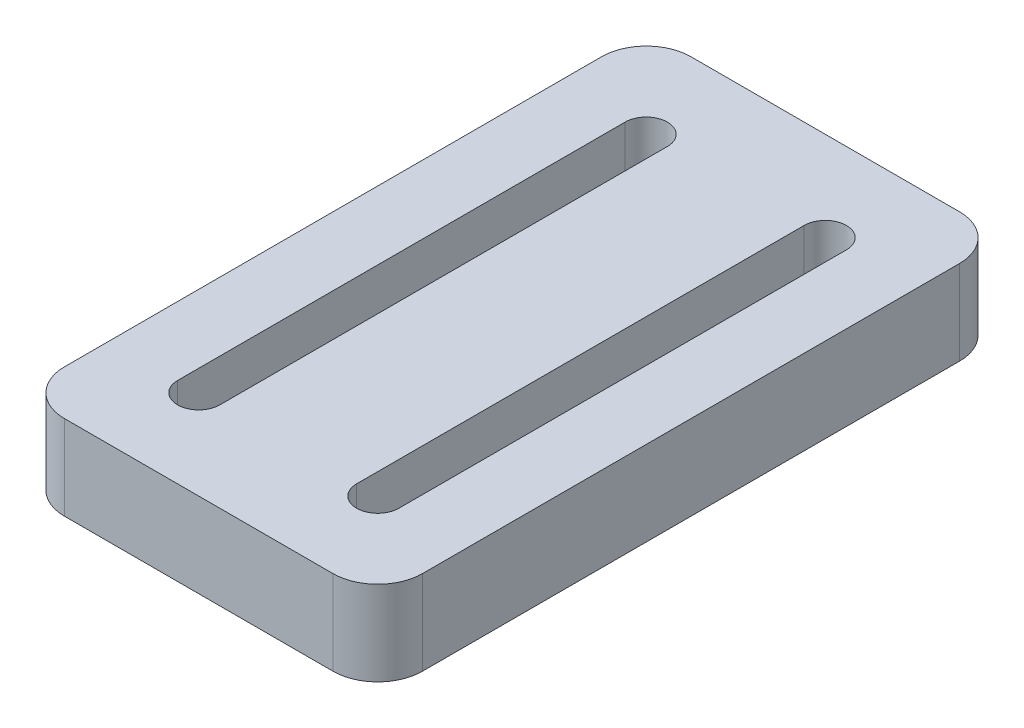
ISO-10303-21;
HEADER;
FILE_DESCRIPTION(('STEP AP214'),'2;1');
FILE_NAME('part.step','',(''),(''),'','','');
FILE_SCHEMA(('AUTOMOTIVE_DESIGN { 1 0 10303 214 1 1 1 1 }'));
ENDSEC;
DATA;
#1=APPLICATION_CONTEXT('core data for automotive mechanical design processes');
#2=APPLICATION_PROTOCOL_DEFINITION('international standard','automotive_design',2000,#1);
#3=PRODUCT_CONTEXT('',#1,'mechanical');
#4=PRODUCT('Part','Part','',(#3));
#5=PRODUCT_RELATED_PRODUCT_CATEGORY('part','',(#4));
#6=PRODUCT_DEFINITION_FORMATION('','',#4);
#7=PRODUCT_DEFINITION_CONTEXT('part definition',#1,'design');
#8=PRODUCT_DEFINITION('design','',#6,#7);
#9=PRODUCT_DEFINITION_SHAPE('','',#8);
#10=(LENGTH_UNIT() NAMED_UNIT(*) SI_UNIT(.MILLI.,.METRE.));
#11=(NAMED_UNIT(*) PLANE_ANGLE_UNIT() SI_UNIT($,.RADIAN.));
#12=(NAMED_UNIT(*) SI_UNIT($,.STERADIAN.) SOLID_ANGLE_UNIT());
#13=UNCERTAINTY_MEASURE_WITH_UNIT(LENGTH_MEASURE(1.E-05),#10,'distance_accuracy_value','');
#14=(GEOMETRIC_REPRESENTATION_CONTEXT(3) GLOBAL_UNCERTAINTY_ASSIGNED_CONTEXT((#13)) GLOBAL_UNIT_ASSIGNED_CONTEXT((#10,
#11,#12)) REPRESENTATION_CONTEXT('',''));
#15=CARTESIAN_POINT('',(0.,0.,0.));
#16=DIRECTION('',(0.,0.,1.));
#17=DIRECTION('',(1.,0.,0.));
#18=AXIS2_PLACEMENT_3D('',#15,#16,#17);
#19=CARTESIAN_POINT('',(0.,3.,0.));
#20=DIRECTION('',(0.,1.,0.));
#21=DIRECTION('',(0.,0.,1.));
#22=AXIS2_PLACEMENT_3D('',#19,#20,#21);
#23=PLANE('',#22);
#24=DIRECTION('',(-1.,0.,0.));
#25=VECTOR('',#24,1.);
#26=CARTESIAN_POINT('',(12.7,3.,-22.225));
#27=LINE('',#26,#25);
#28=CARTESIAN_POINT('',(9.525,3.,-22.225));
#29=VERTEX_POINT('',#28);
#30=CARTESIAN_POINT('',(-9.525,3.,-22.225));
#31=VERTEX_POINT('',#30);
#32=EDGE_CURVE('E305',#29,#31,#27,.T.);
#33=ORIENTED_EDGE('',*,*,#32,.T.);
#34=CARTESIAN_POINT('',(-9.525,3.,-19.05));
#35=DIRECTION('',(0.,1.,0.));
#36=DIRECTION('',(0.,0.,1.));
#37=AXIS2_PLACEMENT_3D('',#34,#35,#36);
#38=CIRCLE('',#37,3.175);
#39=CARTESIAN_POINT('',(-12.7,3.,-19.05));
#40=VERTEX_POINT('',#39);
#41=EDGE_CURVE('E354',#31,#40,#38,.T.);
#42=ORIENTED_EDGE('',*,*,#41,.T.);
#43=DIRECTION('',(0.,0.,1.));
#44=VECTOR('',#43,1.);
#45=CARTESIAN_POINT('',(-12.7,3.,22.225));
#46=LINE('',#45,#44);
#47=CARTESIAN_POINT('',(-12.7,3.,19.05));
#48=VERTEX_POINT('',#47);
#49=EDGE_CURVE('E271',#40,#48,#46,.T.);
#50=ORIENTED_EDGE('',*,*,#49,.T.);
#51=CARTESIAN_POINT('',(-9.525,3.,19.05));
#52=DIRECTION('',(0.,1.,0.));
#53=DIRECTION('',(0.,0.,1.));
#54=AXIS2_PLACEMENT_3D('',#51,#52,#53);
#55=CIRCLE('',#54,3.175);
#56=CARTESIAN_POINT('',(-9.525,3.,22.225));
#57=VERTEX_POINT('',#56);
#58=EDGE_CURVE('E288',#48,#57,#55,.T.);
#59=ORIENTED_EDGE('',*,*,#58,.T.);
#60=DIRECTION('',(1.,0.,0.));
#61=VECTOR('',#60,1.);
#62=CARTESIAN_POINT('',(12.7,3.,22.225));
#63=LINE('',#62,#61);
#64=CARTESIAN_POINT('',(9.525,3.,22.225));
#65=VERTEX_POINT('',#64);
#66=EDGE_CURVE('E276',#57,#65,#63,.T.);
#67=ORIENTED_EDGE('',*,*,#66,.T.);
#68=CARTESIAN_POINT('',(9.525,3.,19.05));
#69=DIRECTION('',(0.,1.,0.));
#70=DIRECTION('',(0.,0.,1.));
#71=AXIS2_PLACEMENT_3D('',#68,#69,#70);
#72=CIRCLE('',#71,3.175);
#73=CARTESIAN_POINT('',(12.7,3.,19.05));
#74=VERTEX_POINT('',#73);
#75=EDGE_CURVE('E71',#65,#74,#72,.T.);
#76=ORIENTED_EDGE('',*,*,#75,.T.);
#77=DIRECTION('',(0.,0.,-1.));
#78=VECTOR('',#77,1.);
#79=CARTESIAN_POINT('',(12.7,3.,22.225));
#80=LINE('',#79,#78);
#81=CARTESIAN_POINT('',(12.7,3.,-19.05));
#82=VERTEX_POINT('',#81);
#83=EDGE_CURVE('E301',#74,#82,#80,.T.);
#84=ORIENTED_EDGE('',*,*,#83,.T.);
#85=CARTESIAN_POINT('',(9.525,3.,-19.05));
#86=DIRECTION('',(0.,1.,0.));
#87=DIRECTION('',(0.,0.,1.));
#88=AXIS2_PLACEMENT_3D('',#85,#86,#87);
#89=CIRCLE('',#88,3.175);
#90=EDGE_CURVE('E298',#82,#29,#89,.T.);
#91=ORIENTED_EDGE('',*,*,#90,.T.);
#92=EDGE_LOOP('',(#33,#42,#50,#59,#67,#76,#84,#91));
#93=FACE_BOUND('',#92,.T.);
#94=DIRECTION('',(0.,0.,-1.));
#95=VECTOR('',#94,1.);
#96=CARTESIAN_POINT('',(-4.84999999999999,3.,15.875));
#97=LINE('',#96,#95);
#98=CARTESIAN_POINT('',(-4.84999999999999,3.,15.875));
#99=VERTEX_POINT('',#98);
#100=CARTESIAN_POINT('',(-4.85,3.,-15.875));
#101=VERTEX_POINT('',#100);
#102=EDGE_CURVE('E229',#99,#101,#97,.T.);
#103=ORIENTED_EDGE('',*,*,#102,.F.);
#104=CARTESIAN_POINT('',(-6.35,3.,15.875));
#105=DIRECTION('',(0.,1.,0.));
#106=DIRECTION('',(0.,0.,1.));
#107=AXIS2_PLACEMENT_3D('',#104,#105,#106);
#108=CIRCLE('',#107,1.5);
#109=CARTESIAN_POINT('',(-7.84999999999999,3.,15.875));
#110=VERTEX_POINT('',#109);
#111=EDGE_CURVE('E225',#110,#99,#108,.T.);
#112=ORIENTED_EDGE('',*,*,#111,.F.);
#113=DIRECTION('',(0.,0.,1.));
#114=VECTOR('',#113,1.);
#115=CARTESIAN_POINT('',(-7.84999999999999,3.,15.875));
#116=LINE('',#115,#114);
#117=CARTESIAN_POINT('',(-7.84999999999999,3.,-15.875));
#118=VERTEX_POINT('',#117);
#119=EDGE_CURVE('E236',#118,#110,#116,.T.);
#120=ORIENTED_EDGE('',*,*,#119,.F.);
#121=CARTESIAN_POINT('',(-6.35,3.,-15.875));
#122=DIRECTION('',(0.,1.,0.));
#123=DIRECTION('',(0.,0.,1.));
#124=AXIS2_PLACEMENT_3D('',#121,#122,#123);
#125=CIRCLE('',#124,1.5);
#126=EDGE_CURVE('E241',#101,#118,#125,.T.);
#127=ORIENTED_EDGE('',*,*,#126,.F.);
#128=EDGE_LOOP('',(#103,#112,#120,#127));
#129=FACE_BOUND('',#128,.T.);
#130=DIRECTION('',(0.,0.,-1.));
#131=VECTOR('',#130,1.);
#132=CARTESIAN_POINT('',(7.85,3.,15.875));
#133=LINE('',#132,#131);
#134=CARTESIAN_POINT('',(7.85,3.,15.875));
#135=VERTEX_POINT('',#134);
#136=CARTESIAN_POINT('',(7.85,3.,-15.875));
#137=VERTEX_POINT('',#136);
#138=EDGE_CURVE('E175',#135,#137,#133,.T.);
#139=ORIENTED_EDGE('',*,*,#138,.F.);
#140=CARTESIAN_POINT('',(6.35,3.,15.875));
#141=DIRECTION('',(0.,1.,0.));
#142=DIRECTION('',(0.,0.,1.));
#143=AXIS2_PLACEMENT_3D('',#140,#141,#142);
#144=CIRCLE('',#143,1.5);
#145=CARTESIAN_POINT('',(4.85,3.,15.875));
#146=VERTEX_POINT('',#145);
#147=EDGE_CURVE('E164',#146,#135,#144,.T.);
#148=ORIENTED_EDGE('',*,*,#147,.F.);
#149=DIRECTION('',(0.,0.,1.));
#150=VECTOR('',#149,1.);
#151=CARTESIAN_POINT('',(4.85,3.,15.875));
#152=LINE('',#151,#150);
#153=CARTESIAN_POINT('',(4.85,3.,-15.875));
#154=VERTEX_POINT('',#153);
#155=EDGE_CURVE('E193',#154,#146,#152,.T.);
#156=ORIENTED_EDGE('',*,*,#155,.F.);
#157=CARTESIAN_POINT('',(6.35,3.,-15.875));
#158=DIRECTION('',(0.,1.,0.));
#159=DIRECTION('',(0.,0.,1.));
#160=AXIS2_PLACEMENT_3D('',#157,#158,#159);
#161=CIRCLE('',#160,1.5);
#162=EDGE_CURVE('E189',#137,#154,#161,.T.);
#163=ORIENTED_EDGE('',*,*,#162,.F.);
#164=EDGE_LOOP('',(#139,#148,#156,#163));
#165=FACE_BOUND('',#164,.T.);
#166=ADVANCED_FACE('F48',(#93,#129,#165),#23,.T.);
#167=CARTESIAN_POINT('',(0.,-3.,0.));
#168=DIRECTION('',(0.,1.,0.));
#169=DIRECTION('',(0.,0.,1.));
#170=AXIS2_PLACEMENT_3D('',#167,#168,#169);
#171=PLANE('',#170);
#172=CARTESIAN_POINT('',(-6.35,-3.,15.875));
#173=DIRECTION('',(0.,1.,0.));
#174=DIRECTION('',(0.,0.,1.));
#175=AXIS2_PLACEMENT_3D('',#172,#173,#174);
#176=CIRCLE('',#175,1.5);
#177=CARTESIAN_POINT('',(-7.84999999999999,-3.,15.875));
#178=VERTEX_POINT('',#177);
#179=CARTESIAN_POINT('',(-4.84999999999999,-3.,15.875));
#180=VERTEX_POINT('',#179);
#181=EDGE_CURVE('E184',#178,#180,#176,.T.);
#182=ORIENTED_EDGE('',*,*,#181,.T.);
#183=DIRECTION('',(0.,0.,-1.));
#184=VECTOR('',#183,1.);
#185=CARTESIAN_POINT('',(-4.84999999999999,-3.,15.875));
#186=LINE('',#185,#184);
#187=CARTESIAN_POINT('',(-4.85,-3.,-15.875));
#188=VERTEX_POINT('',#187);
#189=EDGE_CURVE('E246',#180,#188,#186,.T.);
#190=ORIENTED_EDGE('',*,*,#189,.T.);
#191=CARTESIAN_POINT('',(-6.35,-3.,-15.875));
#192=DIRECTION('',(0.,1.,0.));
#193=DIRECTION('',(0.,0.,1.));
#194=AXIS2_PLACEMENT_3D('',#191,#192,#193);
#195=CIRCLE('',#194,1.5);
#196=CARTESIAN_POINT('',(-7.84999999999999,-3.,-15.875));
#197=VERTEX_POINT('',#196);
#198=EDGE_CURVE('E250',#188,#197,#195,.T.);
#199=ORIENTED_EDGE('',*,*,#198,.T.);
#200=DIRECTION('',(0.,0.,1.));
#201=VECTOR('',#200,1.);
#202=CARTESIAN_POINT('',(-7.84999999999999,-3.,15.875));
#203=LINE('',#202,#201);
#204=EDGE_CURVE('E230',#197,#178,#203,.T.);
#205=ORIENTED_EDGE('',*,*,#204,.T.);
#206=EDGE_LOOP('',(#182,#190,#199,#205));
#207=FACE_BOUND('',#206,.T.);
#208=DIRECTION('',(0.,0.,1.));
#209=VECTOR('',#208,1.);
#210=CARTESIAN_POINT('',(-12.7,-3.,22.225));
#211=LINE('',#210,#209);
#212=CARTESIAN_POINT('',(-12.7,-3.,-19.05));
#213=VERTEX_POINT('',#212);
#214=CARTESIAN_POINT('',(-12.7,-3.,19.05));
#215=VERTEX_POINT('',#214);
#216=EDGE_CURVE('E270',#213,#215,#211,.T.);
#217=ORIENTED_EDGE('',*,*,#216,.F.);
#218=CARTESIAN_POINT('',(-9.525,-3.,-19.05));
#219=DIRECTION('',(0.,1.,0.));
#220=DIRECTION('',(0.,0.,1.));
#221=AXIS2_PLACEMENT_3D('',#218,#219,#220);
#222=CIRCLE('',#221,3.175);
#223=CARTESIAN_POINT('',(-9.525,-3.,-22.225));
#224=VERTEX_POINT('',#223);
#225=EDGE_CURVE('E339',#213,#224,#222,.F.);
#226=ORIENTED_EDGE('',*,*,#225,.T.);
#227=DIRECTION('',(-1.,0.,0.));
#228=VECTOR('',#227,1.);
#229=CARTESIAN_POINT('',(12.7,-3.,-22.225));
#230=LINE('',#229,#228);
#231=CARTESIAN_POINT('',(9.525,-3.,-22.225));
#232=VERTEX_POINT('',#231);
#233=EDGE_CURVE('E277',#232,#224,#230,.T.);
#234=ORIENTED_EDGE('',*,*,#233,.F.);
#235=CARTESIAN_POINT('',(9.525,-3.,-19.05));
#236=DIRECTION('',(0.,1.,0.));
#237=DIRECTION('',(0.,0.,1.));
#238=AXIS2_PLACEMENT_3D('',#235,#236,#237);
#239=CIRCLE('',#238,3.175);
#240=CARTESIAN_POINT('',(12.7,-3.,-19.05));
#241=VERTEX_POINT('',#240);
#242=EDGE_CURVE('E336',#232,#241,#239,.F.);
#243=ORIENTED_EDGE('',*,*,#242,.T.);
#244=DIRECTION('',(0.,0.,-1.));
#245=VECTOR('',#244,1.);
#246=CARTESIAN_POINT('',(12.7,-3.,22.225));
#247=LINE('',#246,#245);
#248=CARTESIAN_POINT('',(12.7,-3.,19.05));
#249=VERTEX_POINT('',#248);
#250=EDGE_CURVE('E318',#249,#241,#247,.T.);
#251=ORIENTED_EDGE('',*,*,#250,.F.);
#252=CARTESIAN_POINT('',(9.525,-3.,19.05));
#253=DIRECTION('',(0.,1.,0.));
#254=DIRECTION('',(0.,0.,1.));
#255=AXIS2_PLACEMENT_3D('',#252,#253,#254);
#256=CIRCLE('',#255,3.175);
#257=CARTESIAN_POINT('',(9.525,-3.,22.225));
#258=VERTEX_POINT('',#257);
#259=EDGE_CURVE('E333',#249,#258,#256,.F.);
#260=ORIENTED_EDGE('',*,*,#259,.T.);
#261=DIRECTION('',(1.,0.,0.));
#262=VECTOR('',#261,1.);
#263=CARTESIAN_POINT('',(12.7,-3.,22.225));
#264=LINE('',#263,#262);
#265=CARTESIAN_POINT('',(-9.525,-3.,22.225));
#266=VERTEX_POINT('',#265);
#267=EDGE_CURVE('E314',#266,#258,#264,.T.);
#268=ORIENTED_EDGE('',*,*,#267,.F.);
#269=CARTESIAN_POINT('',(-9.525,-3.,19.05));
#270=DIRECTION('',(0.,1.,0.));
#271=DIRECTION('',(0.,0.,1.));
#272=AXIS2_PLACEMENT_3D('',#269,#270,#271);
#273=CIRCLE('',#272,3.175);
#274=EDGE_CURVE('E330',#266,#215,#273,.F.);
#275=ORIENTED_EDGE('',*,*,#274,.T.);
#276=EDGE_LOOP('',(#217,#226,#234,#243,#251,#260,#268,#275));
#277=FACE_BOUND('',#276,.T.);
#278=CARTESIAN_POINT('',(6.35,-3.,15.875));
#279=DIRECTION('',(0.,1.,0.));
#280=DIRECTION('',(0.,0.,1.));
#281=AXIS2_PLACEMENT_3D('',#278,#279,#280);
#282=CIRCLE('',#281,1.5);
#283=CARTESIAN_POINT('',(4.85,-3.,15.875));
#284=VERTEX_POINT('',#283);
#285=CARTESIAN_POINT('',(7.85,-3.,15.875));
#286=VERTEX_POINT('',#285);
#287=EDGE_CURVE('E206',#284,#286,#282,.T.);
#288=ORIENTED_EDGE('',*,*,#287,.T.);
#289=DIRECTION('',(0.,0.,-1.));
#290=VECTOR('',#289,1.);
#291=CARTESIAN_POINT('',(7.85,-3.,15.875));
#292=LINE('',#291,#290);
#293=CARTESIAN_POINT('',(7.85,-3.,-15.875));
#294=VERTEX_POINT('',#293);
#295=EDGE_CURVE('E182',#286,#294,#292,.T.);
#296=ORIENTED_EDGE('',*,*,#295,.T.);
#297=CARTESIAN_POINT('',(6.35,-3.,-15.875));
#298=DIRECTION('',(0.,1.,0.));
#299=DIRECTION('',(0.,0.,1.));
#300=AXIS2_PLACEMENT_3D('',#297,#298,#299);
#301=CIRCLE('',#300,1.5);
#302=CARTESIAN_POINT('',(4.85,-3.,-15.875));
#303=VERTEX_POINT('',#302);
#304=EDGE_CURVE('E211',#294,#303,#301,.T.);
#305=ORIENTED_EDGE('',*,*,#304,.T.);
#306=DIRECTION('',(0.,0.,1.));
#307=VECTOR('',#306,1.);
#308=CARTESIAN_POINT('',(4.85,-3.,15.875));
#309=LINE('',#308,#307);
#310=EDGE_CURVE('E176',#303,#284,#309,.T.);
#311=ORIENTED_EDGE('',*,*,#310,.T.);
#312=EDGE_LOOP('',(#288,#296,#305,#311));
#313=FACE_BOUND('',#312,.T.);
#314=ADVANCED_FACE('F380',(#207,#277,#313),#171,.F.);
#315=CARTESIAN_POINT('',(-12.7,3.,22.225));
#316=DIRECTION('',(1.,0.,0.));
#317=DIRECTION('',(0.,0.,-1.));
#318=AXIS2_PLACEMENT_3D('',#315,#316,#317);
#319=PLANE('',#318);
#320=ORIENTED_EDGE('',*,*,#49,.F.);
#321=DIRECTION('',(0.,-1.,0.));
#322=VECTOR('',#321,1.);
#323=CARTESIAN_POINT('',(-12.7,3.,-19.05));
#324=LINE('',#323,#322);
#325=EDGE_CURVE('E326',#40,#213,#324,.T.);
#326=ORIENTED_EDGE('',*,*,#325,.T.);
#327=ORIENTED_EDGE('',*,*,#216,.T.);
#328=DIRECTION('',(0.,-1.,0.));
#329=VECTOR('',#328,1.);
#330=CARTESIAN_POINT('',(-12.7,3.,19.05));
#331=LINE('',#330,#329);
#332=EDGE_CURVE('E310',#215,#48,#331,.F.);
#333=ORIENTED_EDGE('',*,*,#332,.T.);
#334=EDGE_LOOP('',(#320,#326,#327,#333));
#335=FACE_BOUND('',#334,.T.);
#336=ADVANCED_FACE('F390',(#335),#319,.F.);
#337=CARTESIAN_POINT('',(12.7,3.,22.225));
#338=DIRECTION('',(0.,0.,-1.));
#339=DIRECTION('',(-1.,0.,0.));
#340=AXIS2_PLACEMENT_3D('',#337,#338,#339);
#341=PLANE('',#340);
#342=ORIENTED_EDGE('',*,*,#267,.T.);
#343=DIRECTION('',(0.,-1.,0.));
#344=VECTOR('',#343,1.);
#345=CARTESIAN_POINT('',(9.525,3.,22.225));
#346=LINE('',#345,#344);
#347=EDGE_CURVE('E12',#258,#65,#346,.F.);
#348=ORIENTED_EDGE('',*,*,#347,.T.);
#349=ORIENTED_EDGE('',*,*,#66,.F.);
#350=DIRECTION('',(0.,-1.,0.));
#351=VECTOR('',#350,1.);
#352=CARTESIAN_POINT('',(-9.525,3.,22.225));
#353=LINE('',#352,#351);
#354=EDGE_CURVE('E57',#57,#266,#353,.T.);
#355=ORIENTED_EDGE('',*,*,#354,.T.);
#356=EDGE_LOOP('',(#342,#348,#349,#355));
#357=FACE_BOUND('',#356,.T.);
#358=ADVANCED_FACE('F374',(#357),#341,.F.);
#359=CARTESIAN_POINT('',(12.7,3.,22.225));
#360=DIRECTION('',(-1.,0.,0.));
#361=DIRECTION('',(0.,0.,1.));
#362=AXIS2_PLACEMENT_3D('',#359,#360,#361);
#363=PLANE('',#362);
#364=ORIENTED_EDGE('',*,*,#250,.T.);
#365=DIRECTION('',(0.,-1.,0.));
#366=VECTOR('',#365,1.);
#367=CARTESIAN_POINT('',(12.7,3.,-19.05));
#368=LINE('',#367,#366);
#369=EDGE_CURVE('E64',#241,#82,#368,.F.);
#370=ORIENTED_EDGE('',*,*,#369,.T.);
#371=ORIENTED_EDGE('',*,*,#83,.F.);
#372=DIRECTION('',(0.,-1.,0.));
#373=VECTOR('',#372,1.);
#374=CARTESIAN_POINT('',(12.7,3.,19.05));
#375=LINE('',#374,#373);
#376=EDGE_CURVE('E360',#74,#249,#375,.T.);
#377=ORIENTED_EDGE('',*,*,#376,.T.);
#378=EDGE_LOOP('',(#364,#370,#371,#377));
#379=FACE_BOUND('',#378,.T.);
#380=ADVANCED_FACE('F386',(#379),#363,.F.);
#381=CARTESIAN_POINT('',(12.7,3.,-22.225));
#382=DIRECTION('',(0.,0.,1.));
#383=DIRECTION('',(1.,0.,0.));
#384=AXIS2_PLACEMENT_3D('',#381,#382,#383);
#385=PLANE('',#384);
#386=ORIENTED_EDGE('',*,*,#233,.T.);
#387=DIRECTION('',(0.,-1.,0.));
#388=VECTOR('',#387,1.);
#389=CARTESIAN_POINT('',(-9.525,3.,-22.225));
#390=LINE('',#389,#388);
#391=EDGE_CURVE('E293',#224,#31,#390,.F.);
#392=ORIENTED_EDGE('',*,*,#391,.T.);
#393=ORIENTED_EDGE('',*,*,#32,.F.);
#394=DIRECTION('',(0.,-1.,0.));
#395=VECTOR('',#394,1.);
#396=CARTESIAN_POINT('',(9.525,3.,-22.225));
#397=LINE('',#396,#395);
#398=EDGE_CURVE('E341',#29,#232,#397,.T.);
#399=ORIENTED_EDGE('',*,*,#398,.T.);
#400=EDGE_LOOP('',(#386,#392,#393,#399));
#401=FACE_BOUND('',#400,.T.);
#402=ADVANCED_FACE('F350',(#401),#385,.F.);
#403=CARTESIAN_POINT('',(-6.35,3.,15.875));
#404=DIRECTION('',(0.,-1.,0.));
#405=DIRECTION('',(0.,0.,-1.));
#406=AXIS2_PLACEMENT_3D('',#403,#404,#405);
#407=CYLINDRICAL_SURFACE('',#406,1.5);
#408=ORIENTED_EDGE('',*,*,#181,.F.);
#409=DIRECTION('',(0.,-1.,0.));
#410=VECTOR('',#409,1.);
#411=CARTESIAN_POINT('',(-7.84999999999999,3.,15.875));
#412=LINE('',#411,#410);
#413=EDGE_CURVE('E240',#110,#178,#412,.T.);
#414=ORIENTED_EDGE('',*,*,#413,.F.);
#415=ORIENTED_EDGE('',*,*,#111,.T.);
#416=DIRECTION('',(0.,-1.,0.));
#417=VECTOR('',#416,1.);
#418=CARTESIAN_POINT('',(-4.84999999999999,3.,15.875));
#419=LINE('',#418,#417);
#420=EDGE_CURVE('E266',#99,#180,#419,.T.);
#421=ORIENTED_EDGE('',*,*,#420,.T.);
#422=EDGE_LOOP('',(#408,#414,#415,#421));
#423=FACE_BOUND('',#422,.T.);
#424=ADVANCED_FACE('F405',(#423),#407,.F.);
#425=CARTESIAN_POINT('',(-4.84999999999999,3.,15.875));
#426=DIRECTION('',(-1.,0.,0.));
#427=DIRECTION('',(0.,0.,1.));
#428=AXIS2_PLACEMENT_3D('',#425,#426,#427);
#429=PLANE('',#428);
#430=ORIENTED_EDGE('',*,*,#189,.F.);
#431=ORIENTED_EDGE('',*,*,#420,.F.);
#432=ORIENTED_EDGE('',*,*,#102,.T.);
#433=DIRECTION('',(0.,-1.,0.));
#434=VECTOR('',#433,1.);
#435=CARTESIAN_POINT('',(-4.85,3.,-15.875));
#436=LINE('',#435,#434);
#437=EDGE_CURVE('E263',#101,#188,#436,.T.);
#438=ORIENTED_EDGE('',*,*,#437,.T.);
#439=EDGE_LOOP('',(#430,#431,#432,#438));
#440=FACE_BOUND('',#439,.T.);
#441=ADVANCED_FACE('F487',(#440),#429,.T.);
#442=CARTESIAN_POINT('',(-6.35,3.,-15.875));
#443=DIRECTION('',(0.,-1.,0.));
#444=DIRECTION('',(0.,0.,-1.));
#445=AXIS2_PLACEMENT_3D('',#442,#443,#444);
#446=CYLINDRICAL_SURFACE('',#445,1.5);
#447=ORIENTED_EDGE('',*,*,#198,.F.);
#448=ORIENTED_EDGE('',*,*,#437,.F.);
#449=ORIENTED_EDGE('',*,*,#126,.T.);
#450=DIRECTION('',(0.,-1.,0.));
#451=VECTOR('',#450,1.);
#452=CARTESIAN_POINT('',(-7.84999999999999,3.,-15.875));
#453=LINE('',#452,#451);
#454=EDGE_CURVE('E260',#118,#197,#453,.T.);
#455=ORIENTED_EDGE('',*,*,#454,.T.);
#456=EDGE_LOOP('',(#447,#448,#449,#455));
#457=FACE_BOUND('',#456,.T.);
#458=ADVANCED_FACE('F478',(#457),#446,.F.);
#459=CARTESIAN_POINT('',(-7.84999999999999,3.,15.875));
#460=DIRECTION('',(1.,0.,0.));
#461=DIRECTION('',(0.,0.,-1.));
#462=AXIS2_PLACEMENT_3D('',#459,#460,#461);
#463=PLANE('',#462);
#464=ORIENTED_EDGE('',*,*,#204,.F.);
#465=ORIENTED_EDGE('',*,*,#454,.F.);
#466=ORIENTED_EDGE('',*,*,#119,.T.);
#467=ORIENTED_EDGE('',*,*,#413,.T.);
#468=EDGE_LOOP('',(#464,#465,#466,#467));
#469=FACE_BOUND('',#468,.T.);
#470=ADVANCED_FACE('F470',(#469),#463,.T.);
#471=CARTESIAN_POINT('',(6.35,3.,15.875));
#472=DIRECTION('',(0.,-1.,0.));
#473=DIRECTION('',(0.,0.,-1.));
#474=AXIS2_PLACEMENT_3D('',#471,#472,#473);
#475=CYLINDRICAL_SURFACE('',#474,1.5);
#476=ORIENTED_EDGE('',*,*,#287,.F.);
#477=DIRECTION('',(0.,-1.,0.));
#478=VECTOR('',#477,1.);
#479=CARTESIAN_POINT('',(4.85,3.,15.875));
#480=LINE('',#479,#478);
#481=EDGE_CURVE('E170',#146,#284,#480,.T.);
#482=ORIENTED_EDGE('',*,*,#481,.F.);
#483=ORIENTED_EDGE('',*,*,#147,.T.);
#484=DIRECTION('',(0.,-1.,0.));
#485=VECTOR('',#484,1.);
#486=CARTESIAN_POINT('',(7.85,3.,15.875));
#487=LINE('',#486,#485);
#488=EDGE_CURVE('E167',#135,#286,#487,.T.);
#489=ORIENTED_EDGE('',*,*,#488,.T.);
#490=EDGE_LOOP('',(#476,#482,#483,#489));
#491=FACE_BOUND('',#490,.T.);
#492=ADVANCED_FACE('F166',(#491),#475,.F.);
#493=CARTESIAN_POINT('',(7.85,3.,15.875));
#494=DIRECTION('',(-1.,0.,0.));
#495=DIRECTION('',(0.,0.,1.));
#496=AXIS2_PLACEMENT_3D('',#493,#494,#495);
#497=PLANE('',#496);
#498=ORIENTED_EDGE('',*,*,#295,.F.);
#499=ORIENTED_EDGE('',*,*,#488,.F.);
#500=ORIENTED_EDGE('',*,*,#138,.T.);
#501=DIRECTION('',(0.,-1.,0.));
#502=VECTOR('',#501,1.);
#503=CARTESIAN_POINT('',(7.85,3.,-15.875));
#504=LINE('',#503,#502);
#505=EDGE_CURVE('E185',#137,#294,#504,.T.);
#506=ORIENTED_EDGE('',*,*,#505,.T.);
#507=EDGE_LOOP('',(#498,#499,#500,#506));
#508=FACE_BOUND('',#507,.T.);
#509=ADVANCED_FACE('F179',(#508),#497,.T.);
#510=CARTESIAN_POINT('',(6.35,3.,-15.875));
#511=DIRECTION('',(0.,-1.,0.));
#512=DIRECTION('',(0.,0.,-1.));
#513=AXIS2_PLACEMENT_3D('',#510,#511,#512);
#514=CYLINDRICAL_SURFACE('',#513,1.5);
#515=ORIENTED_EDGE('',*,*,#304,.F.);
#516=ORIENTED_EDGE('',*,*,#505,.F.);
#517=ORIENTED_EDGE('',*,*,#162,.T.);
#518=DIRECTION('',(0.,-1.,0.));
#519=VECTOR('',#518,1.);
#520=CARTESIAN_POINT('',(4.85,3.,-15.875));
#521=LINE('',#520,#519);
#522=EDGE_CURVE('E220',#154,#303,#521,.T.);
#523=ORIENTED_EDGE('',*,*,#522,.T.);
#524=EDGE_LOOP('',(#515,#516,#517,#523));
#525=FACE_BOUND('',#524,.T.);
#526=ADVANCED_FACE('F446',(#525),#514,.F.);
#527=CARTESIAN_POINT('',(4.85,3.,15.875));
#528=DIRECTION('',(1.,0.,0.));
#529=DIRECTION('',(0.,0.,-1.));
#530=AXIS2_PLACEMENT_3D('',#527,#528,#529);
#531=PLANE('',#530);
#532=ORIENTED_EDGE('',*,*,#310,.F.);
#533=ORIENTED_EDGE('',*,*,#522,.F.);
#534=ORIENTED_EDGE('',*,*,#155,.T.);
#535=ORIENTED_EDGE('',*,*,#481,.T.);
#536=EDGE_LOOP('',(#532,#533,#534,#535));
#537=FACE_BOUND('',#536,.T.);
#538=ADVANCED_FACE('F418',(#537),#531,.T.);
#539=CARTESIAN_POINT('',(-9.525,3.,-19.05));
#540=DIRECTION('',(0.,-1.,0.));
#541=DIRECTION('',(0.,0.,-1.));
#542=AXIS2_PLACEMENT_3D('',#539,#540,#541);
#543=CYLINDRICAL_SURFACE('',#542,3.175);
#544=ORIENTED_EDGE('',*,*,#41,.F.);
#545=ORIENTED_EDGE('',*,*,#391,.F.);
#546=ORIENTED_EDGE('',*,*,#225,.F.);
#547=ORIENTED_EDGE('',*,*,#325,.F.);
#548=EDGE_LOOP('',(#544,#545,#546,#547));
#549=FACE_BOUND('',#548,.T.);
#550=ADVANCED_FACE('F358',(#549),#543,.T.);
#551=CARTESIAN_POINT('',(9.525,3.,-19.05));
#552=DIRECTION('',(0.,-1.,0.));
#553=DIRECTION('',(0.,0.,-1.));
#554=AXIS2_PLACEMENT_3D('',#551,#552,#553);
#555=CYLINDRICAL_SURFACE('',#554,3.175);
#556=ORIENTED_EDGE('',*,*,#90,.F.);
#557=ORIENTED_EDGE('',*,*,#369,.F.);
#558=ORIENTED_EDGE('',*,*,#242,.F.);
#559=ORIENTED_EDGE('',*,*,#398,.F.);
#560=EDGE_LOOP('',(#556,#557,#558,#559));
#561=FACE_BOUND('',#560,.T.);
#562=ADVANCED_FACE('F388',(#561),#555,.T.);
#563=CARTESIAN_POINT('',(9.525,3.,19.05));
#564=DIRECTION('',(0.,-1.,0.));
#565=DIRECTION('',(0.,0.,-1.));
#566=AXIS2_PLACEMENT_3D('',#563,#564,#565);
#567=CYLINDRICAL_SURFACE('',#566,3.175);
#568=ORIENTED_EDGE('',*,*,#75,.F.);
#569=ORIENTED_EDGE('',*,*,#347,.F.);
#570=ORIENTED_EDGE('',*,*,#259,.F.);
#571=ORIENTED_EDGE('',*,*,#376,.F.);
#572=EDGE_LOOP('',(#568,#569,#570,#571));
#573=FACE_BOUND('',#572,.T.);
#574=ADVANCED_FACE('F385',(#573),#567,.T.);
#575=CARTESIAN_POINT('',(-9.525,3.,19.05));
#576=DIRECTION('',(0.,-1.,0.));
#577=DIRECTION('',(0.,0.,-1.));
#578=AXIS2_PLACEMENT_3D('',#575,#576,#577);
#579=CYLINDRICAL_SURFACE('',#578,3.175);
#580=ORIENTED_EDGE('',*,*,#58,.F.);
#581=ORIENTED_EDGE('',*,*,#332,.F.);
#582=ORIENTED_EDGE('',*,*,#274,.F.);
#583=ORIENTED_EDGE('',*,*,#354,.F.);
#584=EDGE_LOOP('',(#580,#581,#582,#583));
#585=FACE_BOUND('',#584,.T.);
#586=ADVANCED_FACE('F50',(#585),#579,.T.);
#587=CLOSED_SHELL('',(#166,#314,#336,#358,#380,#402,#424,#441,#458,#470,#492,#509,#526,#538,
#550,#562,#574,#586));
#588=MANIFOLD_SOLID_BREP('B2',#587);
#589=ADVANCED_BREP_SHAPE_REPRESENTATION('',(#18,#588),#14);
#590=SHAPE_DEFINITION_REPRESENTATION(#9,#589);
ENDSEC;
END-ISO-10303-21;
